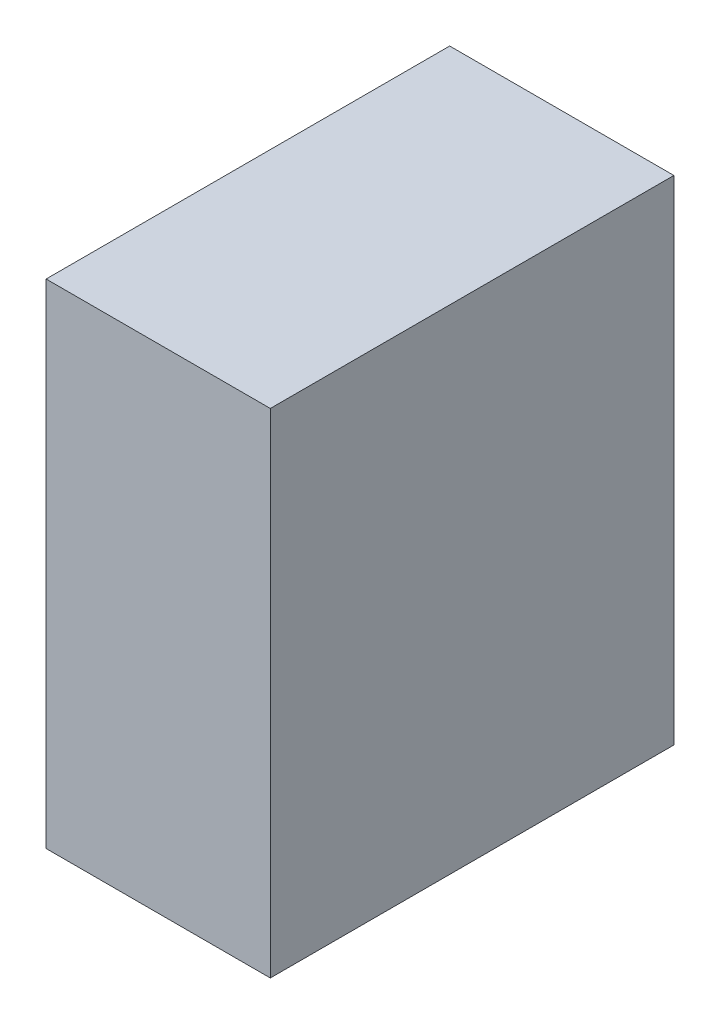
ISO-10303-21;
HEADER;
FILE_DESCRIPTION(('STEP AP214'),'2;1');
FILE_NAME('part.step','',(''),(''),'','','');
FILE_SCHEMA(('AUTOMOTIVE_DESIGN { 1 0 10303 214 1 1 1 1 }'));
ENDSEC;
DATA;
#1=APPLICATION_CONTEXT('core data for automotive mechanical design processes');
#2=APPLICATION_PROTOCOL_DEFINITION('international standard','automotive_design',2000,#1);
#3=PRODUCT_CONTEXT('',#1,'mechanical');
#4=PRODUCT('Part','Part','',(#3));
#5=PRODUCT_RELATED_PRODUCT_CATEGORY('part','',(#4));
#6=PRODUCT_DEFINITION_FORMATION('','',#4);
#7=PRODUCT_DEFINITION_CONTEXT('part definition',#1,'design');
#8=PRODUCT_DEFINITION('design','',#6,#7);
#9=PRODUCT_DEFINITION_SHAPE('','',#8);
#10=(LENGTH_UNIT() NAMED_UNIT(*) SI_UNIT(.MILLI.,.METRE.));
#11=(NAMED_UNIT(*) PLANE_ANGLE_UNIT() SI_UNIT($,.RADIAN.));
#12=(NAMED_UNIT(*) SI_UNIT($,.STERADIAN.) SOLID_ANGLE_UNIT());
#13=UNCERTAINTY_MEASURE_WITH_UNIT(LENGTH_MEASURE(1.E-05),#10,'distance_accuracy_value','');
#14=(GEOMETRIC_REPRESENTATION_CONTEXT(3) GLOBAL_UNCERTAINTY_ASSIGNED_CONTEXT((#13)) GLOBAL_UNIT_ASSIGNED_CONTEXT((#10,
#11,#12)) REPRESENTATION_CONTEXT('',''));
#15=CARTESIAN_POINT('',(0.,0.,0.));
#16=DIRECTION('',(0.,0.,1.));
#17=DIRECTION('',(1.,0.,0.));
#18=AXIS2_PLACEMENT_3D('',#15,#16,#17);
#19=CARTESIAN_POINT('',(25.,0.,0.));
#20=DIRECTION('',(0.,0.,-1.));
#21=DIRECTION('',(-1.,0.,0.));
#22=AXIS2_PLACEMENT_3D('',#19,#20,#21);
#23=PLANE('',#22);
#24=DIRECTION('',(0.,-1.,0.));
#25=VECTOR('',#24,1.);
#26=CARTESIAN_POINT('',(-25.,0.,0.));
#27=LINE('',#26,#25);
#28=CARTESIAN_POINT('',(-25.,110.,0.));
#29=VERTEX_POINT('',#28);
#30=CARTESIAN_POINT('',(-25.,0.,0.));
#31=VERTEX_POINT('',#30);
#32=EDGE_CURVE('E107',#29,#31,#27,.T.);
#33=ORIENTED_EDGE('',*,*,#32,.T.);
#34=DIRECTION('',(-1.,0.,0.));
#35=VECTOR('',#34,1.);
#36=CARTESIAN_POINT('',(25.,0.,0.));
#37=LINE('',#36,#35);
#38=CARTESIAN_POINT('',(25.,0.,0.));
#39=VERTEX_POINT('',#38);
#40=EDGE_CURVE('E11',#39,#31,#37,.T.);
#41=ORIENTED_EDGE('',*,*,#40,.F.);
#42=DIRECTION('',(0.,-1.,0.));
#43=VECTOR('',#42,1.);
#44=CARTESIAN_POINT('',(25.,0.,0.));
#45=LINE('',#44,#43);
#46=CARTESIAN_POINT('',(25.,110.,0.));
#47=VERTEX_POINT('',#46);
#48=EDGE_CURVE('E91',#47,#39,#45,.T.);
#49=ORIENTED_EDGE('',*,*,#48,.F.);
#50=DIRECTION('',(-1.,0.,0.));
#51=VECTOR('',#50,1.);
#52=CARTESIAN_POINT('',(25.,110.,0.));
#53=LINE('',#52,#51);
#54=EDGE_CURVE('E103',#47,#29,#53,.T.);
#55=ORIENTED_EDGE('',*,*,#54,.T.);
#56=EDGE_LOOP('',(#33,#41,#49,#55));
#57=FACE_BOUND('',#56,.T.);
#58=ADVANCED_FACE('F39',(#57),#23,.F.);
#59=CARTESIAN_POINT('',(25.,0.,0.));
#60=DIRECTION('',(0.,1.,0.));
#61=DIRECTION('',(0.,0.,1.));
#62=AXIS2_PLACEMENT_3D('',#59,#60,#61);
#63=PLANE('',#62);
#64=DIRECTION('',(0.,0.,-1.));
#65=VECTOR('',#64,1.);
#66=CARTESIAN_POINT('',(-25.,0.,0.));
#67=LINE('',#66,#65);
#68=CARTESIAN_POINT('',(-25.,0.,-90.));
#69=VERTEX_POINT('',#68);
#70=EDGE_CURVE('E96',#31,#69,#67,.T.);
#71=ORIENTED_EDGE('',*,*,#70,.T.);
#72=DIRECTION('',(-1.,0.,0.));
#73=VECTOR('',#72,1.);
#74=CARTESIAN_POINT('',(25.,0.,-90.));
#75=LINE('',#74,#73);
#76=CARTESIAN_POINT('',(25.,0.,-90.));
#77=VERTEX_POINT('',#76);
#78=EDGE_CURVE('E48',#77,#69,#75,.T.);
#79=ORIENTED_EDGE('',*,*,#78,.F.);
#80=DIRECTION('',(0.,0.,-1.));
#81=VECTOR('',#80,1.);
#82=CARTESIAN_POINT('',(25.,0.,0.));
#83=LINE('',#82,#81);
#84=EDGE_CURVE('E86',#39,#77,#83,.T.);
#85=ORIENTED_EDGE('',*,*,#84,.F.);
#86=ORIENTED_EDGE('',*,*,#40,.T.);
#87=EDGE_LOOP('',(#71,#79,#85,#86));
#88=FACE_BOUND('',#87,.T.);
#89=ADVANCED_FACE('F95',(#88),#63,.F.);
#90=CARTESIAN_POINT('',(25.,0.,-90.));
#91=DIRECTION('',(0.,0.,1.));
#92=DIRECTION('',(1.,0.,0.));
#93=AXIS2_PLACEMENT_3D('',#90,#91,#92);
#94=PLANE('',#93);
#95=DIRECTION('',(0.,1.,0.));
#96=VECTOR('',#95,1.);
#97=CARTESIAN_POINT('',(-25.,0.,-90.));
#98=LINE('',#97,#96);
#99=CARTESIAN_POINT('',(-25.,110.,-90.));
#100=VERTEX_POINT('',#99);
#101=EDGE_CURVE('E73',#69,#100,#98,.T.);
#102=ORIENTED_EDGE('',*,*,#101,.T.);
#103=DIRECTION('',(-1.,0.,0.));
#104=VECTOR('',#103,1.);
#105=CARTESIAN_POINT('',(25.,110.,-90.));
#106=LINE('',#105,#104);
#107=CARTESIAN_POINT('',(25.,110.,-90.));
#108=VERTEX_POINT('',#107);
#109=EDGE_CURVE('E98',#108,#100,#106,.T.);
#110=ORIENTED_EDGE('',*,*,#109,.F.);
#111=DIRECTION('',(0.,1.,0.));
#112=VECTOR('',#111,1.);
#113=CARTESIAN_POINT('',(25.,0.,-90.));
#114=LINE('',#113,#112);
#115=EDGE_CURVE('E89',#77,#108,#114,.T.);
#116=ORIENTED_EDGE('',*,*,#115,.F.);
#117=ORIENTED_EDGE('',*,*,#78,.T.);
#118=EDGE_LOOP('',(#102,#110,#116,#117));
#119=FACE_BOUND('',#118,.T.);
#120=ADVANCED_FACE('F99',(#119),#94,.F.);
#121=CARTESIAN_POINT('',(25.,110.,0.));
#122=DIRECTION('',(0.,-1.,0.));
#123=DIRECTION('',(0.,0.,-1.));
#124=AXIS2_PLACEMENT_3D('',#121,#122,#123);
#125=PLANE('',#124);
#126=DIRECTION('',(0.,0.,1.));
#127=VECTOR('',#126,1.);
#128=CARTESIAN_POINT('',(-25.,110.,0.));
#129=LINE('',#128,#127);
#130=EDGE_CURVE('E79',#100,#29,#129,.T.);
#131=ORIENTED_EDGE('',*,*,#130,.T.);
#132=ORIENTED_EDGE('',*,*,#54,.F.);
#133=DIRECTION('',(0.,0.,1.));
#134=VECTOR('',#133,1.);
#135=CARTESIAN_POINT('',(25.,110.,0.));
#136=LINE('',#135,#134);
#137=EDGE_CURVE('E56',#108,#47,#136,.T.);
#138=ORIENTED_EDGE('',*,*,#137,.F.);
#139=ORIENTED_EDGE('',*,*,#109,.T.);
#140=EDGE_LOOP('',(#131,#132,#138,#139));
#141=FACE_BOUND('',#140,.T.);
#142=ADVANCED_FACE('F120',(#141),#125,.F.);
#143=CARTESIAN_POINT('',(25.,0.,0.));
#144=DIRECTION('',(-1.,0.,0.));
#145=DIRECTION('',(0.,0.,1.));
#146=AXIS2_PLACEMENT_3D('',#143,#144,#145);
#147=PLANE('',#146);
#148=ORIENTED_EDGE('',*,*,#48,.T.);
#149=ORIENTED_EDGE('',*,*,#84,.T.);
#150=ORIENTED_EDGE('',*,*,#115,.T.);
#151=ORIENTED_EDGE('',*,*,#137,.T.);
#152=EDGE_LOOP('',(#148,#149,#150,#151));
#153=FACE_BOUND('',#152,.T.);
#154=ADVANCED_FACE('F87',(#153),#147,.F.);
#155=CARTESIAN_POINT('',(-25.,0.,0.));
#156=DIRECTION('',(-1.,0.,0.));
#157=DIRECTION('',(0.,0.,1.));
#158=AXIS2_PLACEMENT_3D('',#155,#156,#157);
#159=PLANE('',#158);
#160=ORIENTED_EDGE('',*,*,#32,.F.);
#161=ORIENTED_EDGE('',*,*,#130,.F.);
#162=ORIENTED_EDGE('',*,*,#101,.F.);
#163=ORIENTED_EDGE('',*,*,#70,.F.);
#164=EDGE_LOOP('',(#160,#161,#162,#163));
#165=FACE_BOUND('',#164,.T.);
#166=ADVANCED_FACE('F123',(#165),#159,.T.);
#167=CLOSED_SHELL('',(#58,#89,#120,#142,#154,#166));
#168=MANIFOLD_SOLID_BREP('B2',#167);
#169=ADVANCED_BREP_SHAPE_REPRESENTATION('',(#18,#168),#14);
#170=SHAPE_DEFINITION_REPRESENTATION(#9,#169);
ENDSEC;
END-ISO-10303-21;
